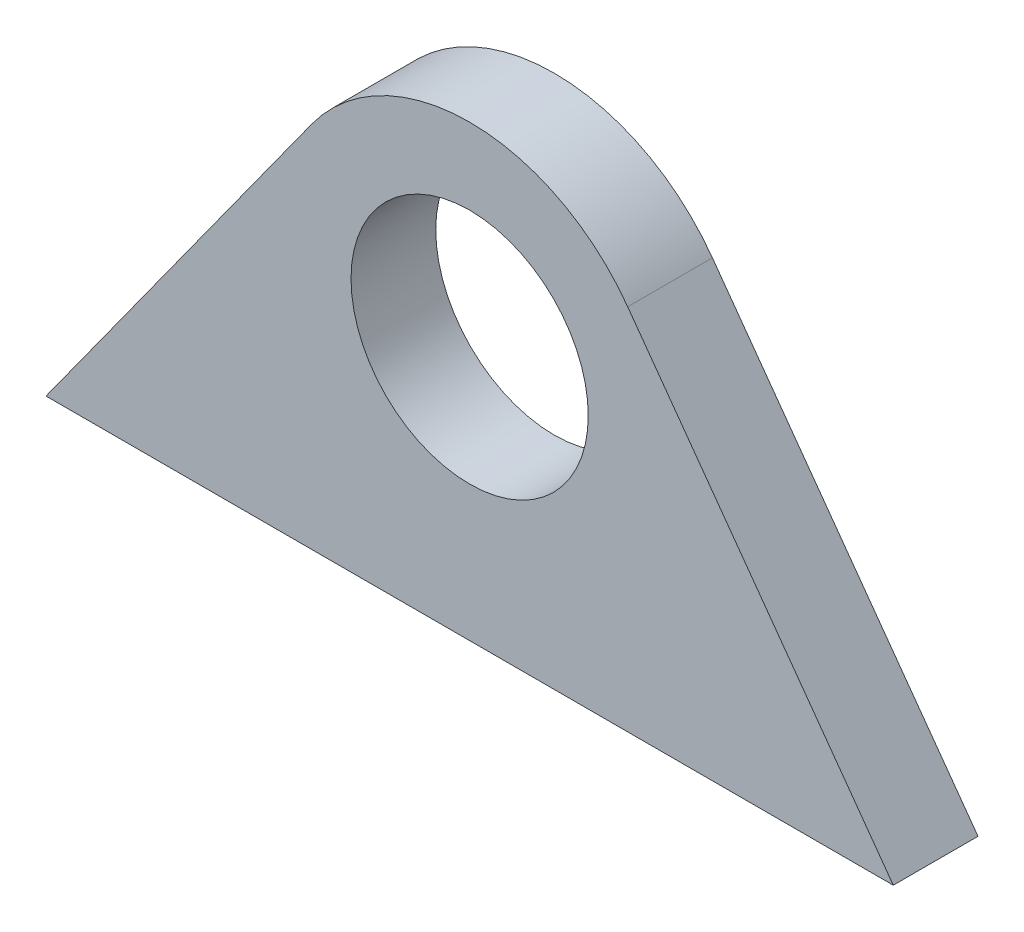
ISO-10303-21;
HEADER;
FILE_DESCRIPTION(('STEP AP214'),'2;1');
FILE_NAME('part.step','',(''),(''),'','','');
FILE_SCHEMA(('AUTOMOTIVE_DESIGN { 1 0 10303 214 1 1 1 1 }'));
ENDSEC;
DATA;
#1=APPLICATION_CONTEXT('core data for automotive mechanical design processes');
#2=APPLICATION_PROTOCOL_DEFINITION('international standard','automotive_design',2000,#1);
#3=PRODUCT_CONTEXT('',#1,'mechanical');
#4=PRODUCT('Part','Part','',(#3));
#5=PRODUCT_RELATED_PRODUCT_CATEGORY('part','',(#4));
#6=PRODUCT_DEFINITION_FORMATION('','',#4);
#7=PRODUCT_DEFINITION_CONTEXT('part definition',#1,'design');
#8=PRODUCT_DEFINITION('design','',#6,#7);
#9=PRODUCT_DEFINITION_SHAPE('','',#8);
#10=(LENGTH_UNIT() NAMED_UNIT(*) SI_UNIT(.MILLI.,.METRE.));
#11=(NAMED_UNIT(*) PLANE_ANGLE_UNIT() SI_UNIT($,.RADIAN.));
#12=(NAMED_UNIT(*) SI_UNIT($,.STERADIAN.) SOLID_ANGLE_UNIT());
#13=UNCERTAINTY_MEASURE_WITH_UNIT(LENGTH_MEASURE(1.E-05),#10,'distance_accuracy_value','');
#14=(GEOMETRIC_REPRESENTATION_CONTEXT(3) GLOBAL_UNCERTAINTY_ASSIGNED_CONTEXT((#13)) GLOBAL_UNIT_ASSIGNED_CONTEXT((#10,
#11,#12)) REPRESENTATION_CONTEXT('',''));
#15=CARTESIAN_POINT('',(0.,0.,0.));
#16=DIRECTION('',(0.,0.,1.));
#17=DIRECTION('',(1.,0.,0.));
#18=AXIS2_PLACEMENT_3D('',#15,#16,#17);
#19=CARTESIAN_POINT('',(0.,0.,5.));
#20=DIRECTION('',(0.,0.,1.));
#21=DIRECTION('',(1.,0.,0.));
#22=AXIS2_PLACEMENT_3D('',#19,#20,#21);
#23=PLANE('',#22);
#24=DIRECTION('',(-0.585025195565813,0.811015117339487,0.));
#25=VECTOR('',#24,1.);
#26=CARTESIAN_POINT('',(25.,-15.,5.));
#27=LINE('',#26,#25);
#28=CARTESIAN_POINT('',(25.,-15.,5.));
#29=VERTEX_POINT('',#28);
#30=CARTESIAN_POINT('',(9.3266738494041,6.72778974900684,5.));
#31=VERTEX_POINT('',#30);
#32=EDGE_CURVE('E92',#29,#31,#27,.T.);
#33=ORIENTED_EDGE('',*,*,#32,.T.);
#34=CARTESIAN_POINT('',(0.,0.,5.));
#35=DIRECTION('',(0.,0.,1.));
#36=DIRECTION('',(1.,0.,0.));
#37=AXIS2_PLACEMENT_3D('',#34,#35,#36);
#38=CIRCLE('',#37,11.5);
#39=CARTESIAN_POINT('',(-9.32667384940411,6.72778974900684,5.));
#40=VERTEX_POINT('',#39);
#41=EDGE_CURVE('E87',#31,#40,#38,.T.);
#42=ORIENTED_EDGE('',*,*,#41,.T.);
#43=DIRECTION('',(-0.585025195565813,-0.811015117339488,0.));
#44=VECTOR('',#43,1.);
#45=CARTESIAN_POINT('',(-25.,-15.,5.));
#46=LINE('',#45,#44);
#47=CARTESIAN_POINT('',(-25.,-15.,5.));
#48=VERTEX_POINT('',#47);
#49=EDGE_CURVE('E90',#40,#48,#46,.T.);
#50=ORIENTED_EDGE('',*,*,#49,.T.);
#51=DIRECTION('',(1.,0.,0.));
#52=VECTOR('',#51,1.);
#53=CARTESIAN_POINT('',(-25.,-15.,5.));
#54=LINE('',#53,#52);
#55=EDGE_CURVE('E57',#48,#29,#54,.T.);
#56=ORIENTED_EDGE('',*,*,#55,.T.);
#57=EDGE_LOOP('',(#33,#42,#50,#56));
#58=FACE_BOUND('',#57,.T.);
#59=CARTESIAN_POINT('',(0.,0.,5.));
#60=DIRECTION('',(0.,0.,1.));
#61=DIRECTION('',(1.,0.,0.));
#62=AXIS2_PLACEMENT_3D('',#59,#60,#61);
#63=CIRCLE('',#62,7.);
#64=CARTESIAN_POINT('',(7.,0.,5.));
#65=VERTEX_POINT('',#64);
#66=EDGE_CURVE('E112',#65,#65,#63,.T.);
#67=ORIENTED_EDGE('',*,*,#66,.F.);
#68=EDGE_LOOP('',(#67));
#69=FACE_BOUND('',#68,.T.);
#70=ADVANCED_FACE('F39',(#58,#69),#23,.T.);
#71=CARTESIAN_POINT('',(0.,0.,0.));
#72=DIRECTION('',(0.,0.,1.));
#73=DIRECTION('',(1.,0.,0.));
#74=AXIS2_PLACEMENT_3D('',#71,#72,#73);
#75=PLANE('',#74);
#76=DIRECTION('',(-0.585025195565813,0.811015117339487,0.));
#77=VECTOR('',#76,1.);
#78=CARTESIAN_POINT('',(25.,-15.,0.));
#79=LINE('',#78,#77);
#80=CARTESIAN_POINT('',(25.,-15.,0.));
#81=VERTEX_POINT('',#80);
#82=CARTESIAN_POINT('',(9.3266738494041,6.72778974900684,0.));
#83=VERTEX_POINT('',#82);
#84=EDGE_CURVE('E108',#81,#83,#79,.T.);
#85=ORIENTED_EDGE('',*,*,#84,.F.);
#86=DIRECTION('',(1.,0.,0.));
#87=VECTOR('',#86,1.);
#88=CARTESIAN_POINT('',(-25.,-15.,0.));
#89=LINE('',#88,#87);
#90=CARTESIAN_POINT('',(-25.,-15.,0.));
#91=VERTEX_POINT('',#90);
#92=EDGE_CURVE('E80',#91,#81,#89,.T.);
#93=ORIENTED_EDGE('',*,*,#92,.F.);
#94=DIRECTION('',(-0.585025195565813,-0.811015117339488,0.));
#95=VECTOR('',#94,1.);
#96=CARTESIAN_POINT('',(-25.,-15.,0.));
#97=LINE('',#96,#95);
#98=CARTESIAN_POINT('',(-9.32667384940411,6.72778974900684,0.));
#99=VERTEX_POINT('',#98);
#100=EDGE_CURVE('E74',#99,#91,#97,.T.);
#101=ORIENTED_EDGE('',*,*,#100,.F.);
#102=CARTESIAN_POINT('',(0.,0.,0.));
#103=DIRECTION('',(0.,0.,1.));
#104=DIRECTION('',(1.,0.,0.));
#105=AXIS2_PLACEMENT_3D('',#102,#103,#104);
#106=CIRCLE('',#105,11.5);
#107=EDGE_CURVE('E97',#83,#99,#106,.T.);
#108=ORIENTED_EDGE('',*,*,#107,.F.);
#109=EDGE_LOOP('',(#85,#93,#101,#108));
#110=FACE_BOUND('',#109,.T.);
#111=CARTESIAN_POINT('',(0.,0.,0.));
#112=DIRECTION('',(0.,0.,1.));
#113=DIRECTION('',(1.,0.,0.));
#114=AXIS2_PLACEMENT_3D('',#111,#112,#113);
#115=CIRCLE('',#114,7.);
#116=CARTESIAN_POINT('',(7.,0.,0.));
#117=VERTEX_POINT('',#116);
#118=EDGE_CURVE('E130',#117,#117,#115,.T.);
#119=ORIENTED_EDGE('',*,*,#118,.T.);
#120=EDGE_LOOP('',(#119));
#121=FACE_BOUND('',#120,.T.);
#122=ADVANCED_FACE('F125',(#110,#121),#75,.F.);
#123=CARTESIAN_POINT('',(25.,-15.,5.));
#124=DIRECTION('',(-0.811015117339487,-0.585025195565813,0.));
#125=DIRECTION('',(0.585025195565813,-0.811015117339487,0.));
#126=AXIS2_PLACEMENT_3D('',#123,#124,#125);
#127=PLANE('',#126);
#128=ORIENTED_EDGE('',*,*,#84,.T.);
#129=DIRECTION('',(0.,0.,-1.));
#130=VECTOR('',#129,1.);
#131=CARTESIAN_POINT('',(9.3266738494041,6.72778974900684,5.));
#132=LINE('',#131,#130);
#133=EDGE_CURVE('E11',#31,#83,#132,.T.);
#134=ORIENTED_EDGE('',*,*,#133,.F.);
#135=ORIENTED_EDGE('',*,*,#32,.F.);
#136=DIRECTION('',(0.,0.,-1.));
#137=VECTOR('',#136,1.);
#138=CARTESIAN_POINT('',(25.,-15.,5.));
#139=LINE('',#138,#137);
#140=EDGE_CURVE('E104',#29,#81,#139,.T.);
#141=ORIENTED_EDGE('',*,*,#140,.T.);
#142=EDGE_LOOP('',(#128,#134,#135,#141));
#143=FACE_BOUND('',#142,.T.);
#144=ADVANCED_FACE('F41',(#143),#127,.F.);
#145=CARTESIAN_POINT('',(0.,0.,5.));
#146=DIRECTION('',(0.,0.,-1.));
#147=DIRECTION('',(-1.,0.,0.));
#148=AXIS2_PLACEMENT_3D('',#145,#146,#147);
#149=CYLINDRICAL_SURFACE('',#148,11.5);
#150=ORIENTED_EDGE('',*,*,#107,.T.);
#151=DIRECTION('',(0.,0.,-1.));
#152=VECTOR('',#151,1.);
#153=CARTESIAN_POINT('',(-9.32667384940411,6.72778974900684,5.));
#154=LINE('',#153,#152);
#155=EDGE_CURVE('E49',#40,#99,#154,.T.);
#156=ORIENTED_EDGE('',*,*,#155,.F.);
#157=ORIENTED_EDGE('',*,*,#41,.F.);
#158=ORIENTED_EDGE('',*,*,#133,.T.);
#159=EDGE_LOOP('',(#150,#156,#157,#158));
#160=FACE_BOUND('',#159,.T.);
#161=ADVANCED_FACE('F96',(#160),#149,.T.);
#162=CARTESIAN_POINT('',(-25.,-15.,5.));
#163=DIRECTION('',(0.811015117339488,-0.585025195565813,0.));
#164=DIRECTION('',(0.585025195565813,0.811015117339488,0.));
#165=AXIS2_PLACEMENT_3D('',#162,#163,#164);
#166=PLANE('',#165);
#167=ORIENTED_EDGE('',*,*,#100,.T.);
#168=DIRECTION('',(0.,0.,-1.));
#169=VECTOR('',#168,1.);
#170=CARTESIAN_POINT('',(-25.,-15.,5.));
#171=LINE('',#170,#169);
#172=EDGE_CURVE('E99',#48,#91,#171,.T.);
#173=ORIENTED_EDGE('',*,*,#172,.F.);
#174=ORIENTED_EDGE('',*,*,#49,.F.);
#175=ORIENTED_EDGE('',*,*,#155,.T.);
#176=EDGE_LOOP('',(#167,#173,#174,#175));
#177=FACE_BOUND('',#176,.T.);
#178=ADVANCED_FACE('F100',(#177),#166,.F.);
#179=CARTESIAN_POINT('',(-25.,-15.,5.));
#180=DIRECTION('',(0.,1.,0.));
#181=DIRECTION('',(-1.,0.,0.));
#182=AXIS2_PLACEMENT_3D('',#179,#180,#181);
#183=PLANE('',#182);
#184=ORIENTED_EDGE('',*,*,#92,.T.);
#185=ORIENTED_EDGE('',*,*,#140,.F.);
#186=ORIENTED_EDGE('',*,*,#55,.F.);
#187=ORIENTED_EDGE('',*,*,#172,.T.);
#188=EDGE_LOOP('',(#184,#185,#186,#187));
#189=FACE_BOUND('',#188,.T.);
#190=ADVANCED_FACE('F122',(#189),#183,.F.);
#191=CARTESIAN_POINT('',(0.,0.,5.));
#192=DIRECTION('',(0.,0.,-1.));
#193=DIRECTION('',(-1.,0.,0.));
#194=AXIS2_PLACEMENT_3D('',#191,#192,#193);
#195=CYLINDRICAL_SURFACE('',#194,7.);
#196=ORIENTED_EDGE('',*,*,#66,.T.);
#197=EDGE_LOOP('',(#196));
#198=FACE_BOUND('',#197,.T.);
#199=ORIENTED_EDGE('',*,*,#118,.F.);
#200=EDGE_LOOP('',(#199));
#201=FACE_BOUND('',#200,.T.);
#202=ADVANCED_FACE('F138',(#198,#201),#195,.F.);
#203=CLOSED_SHELL('',(#70,#122,#144,#161,#178,#190,#202));
#204=MANIFOLD_SOLID_BREP('B2',#203);
#205=ADVANCED_BREP_SHAPE_REPRESENTATION('',(#18,#204),#14);
#206=SHAPE_DEFINITION_REPRESENTATION(#9,#205);
ENDSEC;
END-ISO-10303-21;
